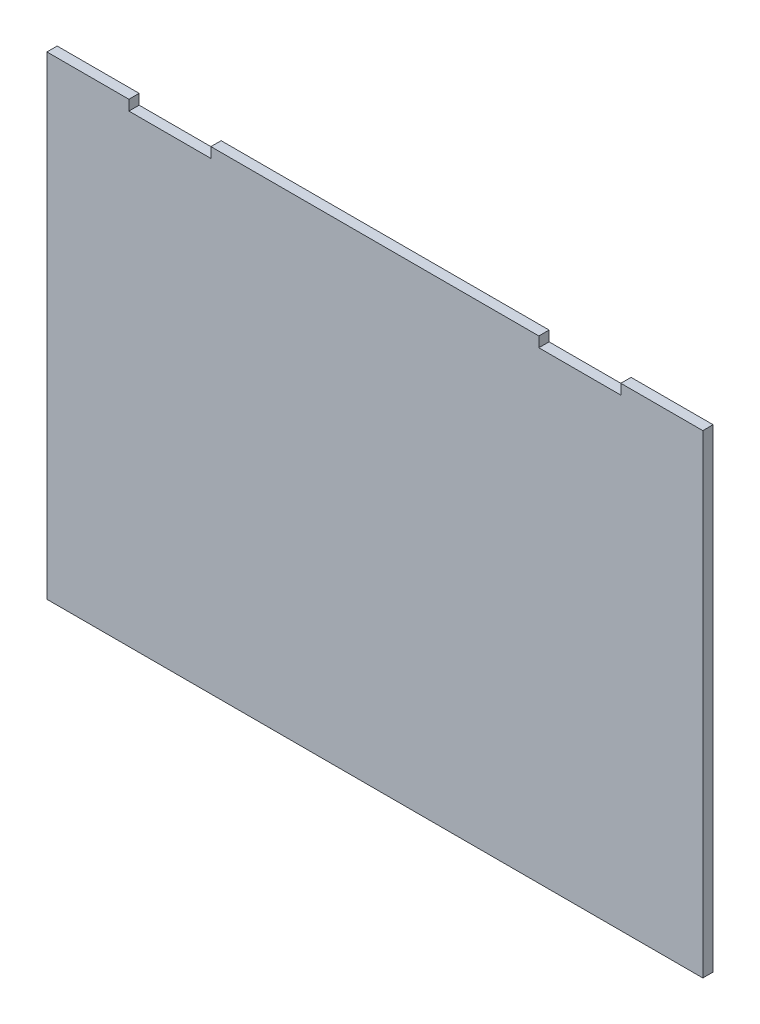
ISO-10303-21;
HEADER;
FILE_DESCRIPTION(('STEP AP214'),'2;1');
FILE_NAME('part.step','',(''),(''),'','','');
FILE_SCHEMA(('AUTOMOTIVE_DESIGN { 1 0 10303 214 1 1 1 1 }'));
ENDSEC;
DATA;
#1=APPLICATION_CONTEXT('core data for automotive mechanical design processes');
#2=APPLICATION_PROTOCOL_DEFINITION('international standard','automotive_design',2000,#1);
#3=PRODUCT_CONTEXT('',#1,'mechanical');
#4=PRODUCT('Part','Part','',(#3));
#5=PRODUCT_RELATED_PRODUCT_CATEGORY('part','',(#4));
#6=PRODUCT_DEFINITION_FORMATION('','',#4);
#7=PRODUCT_DEFINITION_CONTEXT('part definition',#1,'design');
#8=PRODUCT_DEFINITION('design','',#6,#7);
#9=PRODUCT_DEFINITION_SHAPE('','',#8);
#10=(LENGTH_UNIT() NAMED_UNIT(*) SI_UNIT(.MILLI.,.METRE.));
#11=(NAMED_UNIT(*) PLANE_ANGLE_UNIT() SI_UNIT($,.RADIAN.));
#12=(NAMED_UNIT(*) SI_UNIT($,.STERADIAN.) SOLID_ANGLE_UNIT());
#13=UNCERTAINTY_MEASURE_WITH_UNIT(LENGTH_MEASURE(1.E-05),#10,'distance_accuracy_value','');
#14=(GEOMETRIC_REPRESENTATION_CONTEXT(3) GLOBAL_UNCERTAINTY_ASSIGNED_CONTEXT((#13)) GLOBAL_UNIT_ASSIGNED_CONTEXT((#10,
#11,#12)) REPRESENTATION_CONTEXT('',''));
#15=CARTESIAN_POINT('',(0.,0.,0.));
#16=DIRECTION('',(0.,0.,1.));
#17=DIRECTION('',(1.,0.,0.));
#18=AXIS2_PLACEMENT_3D('',#15,#16,#17);
#19=CARTESIAN_POINT('',(-105.228571428572,146.8628,3.175));
#20=DIRECTION('',(1.,0.,0.));
#21=DIRECTION('',(0.,1.,0.));
#22=AXIS2_PLACEMENT_3D('',#19,#20,#21);
#23=PLANE('',#22);
#24=DIRECTION('',(0.,-1.,0.));
#25=VECTOR('',#24,1.);
#26=CARTESIAN_POINT('',(-105.228571428572,146.8628,0.));
#27=LINE('',#26,#25);
#28=CARTESIAN_POINT('',(-105.228571428572,146.8628,0.));
#29=VERTEX_POINT('',#28);
#30=CARTESIAN_POINT('',(-105.228571428572,0.,0.));
#31=VERTEX_POINT('',#30);
#32=EDGE_CURVE('E153',#29,#31,#27,.T.);
#33=ORIENTED_EDGE('',*,*,#32,.T.);
#34=DIRECTION('',(0.,0.,-1.));
#35=VECTOR('',#34,1.);
#36=CARTESIAN_POINT('',(-105.228571428572,0.,3.175));
#37=LINE('',#36,#35);
#38=CARTESIAN_POINT('',(-105.228571428572,0.,3.175));
#39=VERTEX_POINT('',#38);
#40=EDGE_CURVE('E11',#39,#31,#37,.T.);
#41=ORIENTED_EDGE('',*,*,#40,.F.);
#42=DIRECTION('',(0.,-1.,0.));
#43=VECTOR('',#42,1.);
#44=CARTESIAN_POINT('',(-105.228571428572,146.8628,3.175));
#45=LINE('',#44,#43);
#46=CARTESIAN_POINT('',(-105.228571428572,146.8628,3.175));
#47=VERTEX_POINT('',#46);
#48=EDGE_CURVE('E175',#47,#39,#45,.T.);
#49=ORIENTED_EDGE('',*,*,#48,.F.);
#50=DIRECTION('',(0.,0.,-1.));
#51=VECTOR('',#50,1.);
#52=CARTESIAN_POINT('',(-105.228571428572,146.8628,3.175));
#53=LINE('',#52,#51);
#54=EDGE_CURVE('E149',#47,#29,#53,.T.);
#55=ORIENTED_EDGE('',*,*,#54,.T.);
#56=EDGE_LOOP('',(#33,#41,#49,#55));
#57=FACE_BOUND('',#56,.T.);
#58=ADVANCED_FACE('F33',(#57),#23,.F.);
#59=CARTESIAN_POINT('',(-105.228571428572,0.,3.175));
#60=DIRECTION('',(0.,1.,0.));
#61=DIRECTION('',(0.,0.,1.));
#62=AXIS2_PLACEMENT_3D('',#59,#60,#61);
#63=PLANE('',#62);
#64=DIRECTION('',(1.,0.,0.));
#65=VECTOR('',#64,1.);
#66=CARTESIAN_POINT('',(-105.228571428572,0.,0.));
#67=LINE('',#66,#65);
#68=CARTESIAN_POINT('',(97.9714285714285,0.,0.));
#69=VERTEX_POINT('',#68);
#70=EDGE_CURVE('E156',#31,#69,#67,.T.);
#71=ORIENTED_EDGE('',*,*,#70,.T.);
#72=DIRECTION('',(0.,0.,-1.));
#73=VECTOR('',#72,1.);
#74=CARTESIAN_POINT('',(97.9714285714285,0.,3.175));
#75=LINE('',#74,#73);
#76=CARTESIAN_POINT('',(97.9714285714285,0.,3.175));
#77=VERTEX_POINT('',#76);
#78=EDGE_CURVE('E41',#77,#69,#75,.T.);
#79=ORIENTED_EDGE('',*,*,#78,.F.);
#80=DIRECTION('',(1.,0.,0.));
#81=VECTOR('',#80,1.);
#82=CARTESIAN_POINT('',(-105.228571428572,0.,3.175));
#83=LINE('',#82,#81);
#84=EDGE_CURVE('E104',#39,#77,#83,.T.);
#85=ORIENTED_EDGE('',*,*,#84,.F.);
#86=ORIENTED_EDGE('',*,*,#40,.T.);
#87=EDGE_LOOP('',(#71,#79,#85,#86));
#88=FACE_BOUND('',#87,.T.);
#89=ADVANCED_FACE('F253',(#88),#63,.F.);
#90=CARTESIAN_POINT('',(97.9714285714285,0.,3.175));
#91=DIRECTION('',(-1.,0.,0.));
#92=DIRECTION('',(0.,0.,1.));
#93=AXIS2_PLACEMENT_3D('',#90,#91,#92);
#94=PLANE('',#93);
#95=DIRECTION('',(0.,1.,0.));
#96=VECTOR('',#95,1.);
#97=CARTESIAN_POINT('',(97.9714285714285,0.,0.));
#98=LINE('',#97,#96);
#99=CARTESIAN_POINT('',(97.9714285714285,146.8628,0.));
#100=VERTEX_POINT('',#99);
#101=EDGE_CURVE('E158',#69,#100,#98,.T.);
#102=ORIENTED_EDGE('',*,*,#101,.T.);
#103=DIRECTION('',(0.,0.,-1.));
#104=VECTOR('',#103,1.);
#105=CARTESIAN_POINT('',(97.9714285714285,146.8628,3.175));
#106=LINE('',#105,#104);
#107=CARTESIAN_POINT('',(97.9714285714285,146.8628,3.175));
#108=VERTEX_POINT('',#107);
#109=EDGE_CURVE('E194',#108,#100,#106,.T.);
#110=ORIENTED_EDGE('',*,*,#109,.F.);
#111=DIRECTION('',(0.,1.,0.));
#112=VECTOR('',#111,1.);
#113=CARTESIAN_POINT('',(97.9714285714285,0.,3.175));
#114=LINE('',#113,#112);
#115=EDGE_CURVE('E202',#77,#108,#114,.T.);
#116=ORIENTED_EDGE('',*,*,#115,.F.);
#117=ORIENTED_EDGE('',*,*,#78,.T.);
#118=EDGE_LOOP('',(#102,#110,#116,#117));
#119=FACE_BOUND('',#118,.T.);
#120=ADVANCED_FACE('F200',(#119),#94,.F.);
#121=CARTESIAN_POINT('',(97.9714285714285,146.8628,3.175));
#122=DIRECTION('',(0.,-1.,0.));
#123=DIRECTION('',(1.,0.,0.));
#124=AXIS2_PLACEMENT_3D('',#121,#122,#123);
#125=PLANE('',#124);
#126=DIRECTION('',(-1.,0.,0.));
#127=VECTOR('',#126,1.);
#128=CARTESIAN_POINT('',(97.9714285714285,146.8628,0.));
#129=LINE('',#128,#127);
#130=CARTESIAN_POINT('',(72.5714285714285,146.8628,0.));
#131=VERTEX_POINT('',#130);
#132=EDGE_CURVE('E160',#100,#131,#129,.T.);
#133=ORIENTED_EDGE('',*,*,#132,.T.);
#134=DIRECTION('',(0.,0.,-1.));
#135=VECTOR('',#134,1.);
#136=CARTESIAN_POINT('',(72.5714285714285,146.8628,3.175));
#137=LINE('',#136,#135);
#138=CARTESIAN_POINT('',(72.5714285714285,146.8628,3.175));
#139=VERTEX_POINT('',#138);
#140=EDGE_CURVE('E191',#139,#131,#137,.T.);
#141=ORIENTED_EDGE('',*,*,#140,.F.);
#142=DIRECTION('',(-1.,0.,0.));
#143=VECTOR('',#142,1.);
#144=CARTESIAN_POINT('',(97.9714285714285,146.8628,3.175));
#145=LINE('',#144,#143);
#146=EDGE_CURVE('E220',#108,#139,#145,.T.);
#147=ORIENTED_EDGE('',*,*,#146,.F.);
#148=ORIENTED_EDGE('',*,*,#109,.T.);
#149=EDGE_LOOP('',(#133,#141,#147,#148));
#150=FACE_BOUND('',#149,.T.);
#151=ADVANCED_FACE('F211',(#150),#125,.F.);
#152=CARTESIAN_POINT('',(72.5714285714285,146.8628,3.175));
#153=DIRECTION('',(1.,0.,0.));
#154=DIRECTION('',(0.,0.,-1.));
#155=AXIS2_PLACEMENT_3D('',#152,#153,#154);
#156=PLANE('',#155);
#157=DIRECTION('',(0.,-1.,0.));
#158=VECTOR('',#157,1.);
#159=CARTESIAN_POINT('',(72.5714285714285,146.8628,0.));
#160=LINE('',#159,#158);
#161=CARTESIAN_POINT('',(72.5714285714285,143.6878,0.));
#162=VERTEX_POINT('',#161);
#163=EDGE_CURVE('E162',#131,#162,#160,.T.);
#164=ORIENTED_EDGE('',*,*,#163,.T.);
#165=DIRECTION('',(0.,0.,-1.));
#166=VECTOR('',#165,1.);
#167=CARTESIAN_POINT('',(72.5714285714285,143.6878,3.175));
#168=LINE('',#167,#166);
#169=CARTESIAN_POINT('',(72.5714285714285,143.6878,3.175));
#170=VERTEX_POINT('',#169);
#171=EDGE_CURVE('E188',#170,#162,#168,.T.);
#172=ORIENTED_EDGE('',*,*,#171,.F.);
#173=DIRECTION('',(0.,-1.,0.));
#174=VECTOR('',#173,1.);
#175=CARTESIAN_POINT('',(72.5714285714285,146.8628,3.175));
#176=LINE('',#175,#174);
#177=EDGE_CURVE('E217',#139,#170,#176,.T.);
#178=ORIENTED_EDGE('',*,*,#177,.F.);
#179=ORIENTED_EDGE('',*,*,#140,.T.);
#180=EDGE_LOOP('',(#164,#172,#178,#179));
#181=FACE_BOUND('',#180,.T.);
#182=ADVANCED_FACE('F215',(#181),#156,.F.);
#183=CARTESIAN_POINT('',(72.5714285714285,143.6878,3.175));
#184=DIRECTION('',(0.,-1.,0.));
#185=DIRECTION('',(1.,0.,0.));
#186=AXIS2_PLACEMENT_3D('',#183,#184,#185);
#187=PLANE('',#186);
#188=DIRECTION('',(-1.,0.,0.));
#189=VECTOR('',#188,1.);
#190=CARTESIAN_POINT('',(72.5714285714285,143.6878,0.));
#191=LINE('',#190,#189);
#192=CARTESIAN_POINT('',(47.1714285714285,143.6878,0.));
#193=VERTEX_POINT('',#192);
#194=EDGE_CURVE('E164',#162,#193,#191,.T.);
#195=ORIENTED_EDGE('',*,*,#194,.T.);
#196=DIRECTION('',(0.,0.,-1.));
#197=VECTOR('',#196,1.);
#198=CARTESIAN_POINT('',(47.1714285714285,143.6878,3.175));
#199=LINE('',#198,#197);
#200=CARTESIAN_POINT('',(47.1714285714285,143.6878,3.175));
#201=VERTEX_POINT('',#200);
#202=EDGE_CURVE('E185',#201,#193,#199,.T.);
#203=ORIENTED_EDGE('',*,*,#202,.F.);
#204=DIRECTION('',(-1.,0.,0.));
#205=VECTOR('',#204,1.);
#206=CARTESIAN_POINT('',(72.5714285714285,143.6878,3.175));
#207=LINE('',#206,#205);
#208=EDGE_CURVE('E219',#170,#201,#207,.T.);
#209=ORIENTED_EDGE('',*,*,#208,.F.);
#210=ORIENTED_EDGE('',*,*,#171,.T.);
#211=EDGE_LOOP('',(#195,#203,#209,#210));
#212=FACE_BOUND('',#211,.T.);
#213=ADVANCED_FACE('F266',(#212),#187,.F.);
#214=CARTESIAN_POINT('',(47.1714285714285,143.6878,3.175));
#215=DIRECTION('',(-1.,0.,0.));
#216=DIRECTION('',(0.,-1.,0.));
#217=AXIS2_PLACEMENT_3D('',#214,#215,#216);
#218=PLANE('',#217);
#219=DIRECTION('',(0.,1.,0.));
#220=VECTOR('',#219,1.);
#221=CARTESIAN_POINT('',(47.1714285714285,143.6878,0.));
#222=LINE('',#221,#220);
#223=CARTESIAN_POINT('',(47.1714285714284,146.8628,0.));
#224=VERTEX_POINT('',#223);
#225=EDGE_CURVE('E166',#193,#224,#222,.T.);
#226=ORIENTED_EDGE('',*,*,#225,.T.);
#227=DIRECTION('',(0.,0.,-1.));
#228=VECTOR('',#227,1.);
#229=CARTESIAN_POINT('',(47.1714285714284,146.8628,3.175));
#230=LINE('',#229,#228);
#231=CARTESIAN_POINT('',(47.1714285714284,146.8628,3.175));
#232=VERTEX_POINT('',#231);
#233=EDGE_CURVE('E182',#232,#224,#230,.T.);
#234=ORIENTED_EDGE('',*,*,#233,.F.);
#235=DIRECTION('',(0.,1.,0.));
#236=VECTOR('',#235,1.);
#237=CARTESIAN_POINT('',(47.1714285714285,143.6878,3.175));
#238=LINE('',#237,#236);
#239=EDGE_CURVE('E222',#201,#232,#238,.T.);
#240=ORIENTED_EDGE('',*,*,#239,.F.);
#241=ORIENTED_EDGE('',*,*,#202,.T.);
#242=EDGE_LOOP('',(#226,#234,#240,#241));
#243=FACE_BOUND('',#242,.T.);
#244=ADVANCED_FACE('F269',(#243),#218,.F.);
#245=CARTESIAN_POINT('',(47.1714285714284,146.8628,3.175));
#246=DIRECTION('',(0.,-1.,0.));
#247=DIRECTION('',(0.,0.,-1.));
#248=AXIS2_PLACEMENT_3D('',#245,#246,#247);
#249=PLANE('',#248);
#250=DIRECTION('',(-1.,0.,0.));
#251=VECTOR('',#250,1.);
#252=CARTESIAN_POINT('',(47.1714285714284,146.8628,0.));
#253=LINE('',#252,#251);
#254=CARTESIAN_POINT('',(-54.4285714285716,146.8628,0.));
#255=VERTEX_POINT('',#254);
#256=EDGE_CURVE('E168',#224,#255,#253,.T.);
#257=ORIENTED_EDGE('',*,*,#256,.T.);
#258=DIRECTION('',(0.,0.,-1.));
#259=VECTOR('',#258,1.);
#260=CARTESIAN_POINT('',(-54.4285714285716,146.8628,3.175));
#261=LINE('',#260,#259);
#262=CARTESIAN_POINT('',(-54.4285714285716,146.8628,3.175));
#263=VERTEX_POINT('',#262);
#264=EDGE_CURVE('E179',#263,#255,#261,.T.);
#265=ORIENTED_EDGE('',*,*,#264,.F.);
#266=DIRECTION('',(-1.,0.,0.));
#267=VECTOR('',#266,1.);
#268=CARTESIAN_POINT('',(47.1714285714284,146.8628,3.175));
#269=LINE('',#268,#267);
#270=EDGE_CURVE('E228',#232,#263,#269,.T.);
#271=ORIENTED_EDGE('',*,*,#270,.F.);
#272=ORIENTED_EDGE('',*,*,#233,.T.);
#273=EDGE_LOOP('',(#257,#265,#271,#272));
#274=FACE_BOUND('',#273,.T.);
#275=ADVANCED_FACE('F234',(#274),#249,.F.);
#276=CARTESIAN_POINT('',(-54.4285714285716,146.8628,3.175));
#277=DIRECTION('',(1.,0.,0.));
#278=DIRECTION('',(0.,0.,-1.));
#279=AXIS2_PLACEMENT_3D('',#276,#277,#278);
#280=PLANE('',#279);
#281=DIRECTION('',(0.,-1.,0.));
#282=VECTOR('',#281,1.);
#283=CARTESIAN_POINT('',(-54.4285714285716,146.8628,0.));
#284=LINE('',#283,#282);
#285=CARTESIAN_POINT('',(-54.4285714285716,143.6878,0.));
#286=VERTEX_POINT('',#285);
#287=EDGE_CURVE('E170',#255,#286,#284,.T.);
#288=ORIENTED_EDGE('',*,*,#287,.T.);
#289=DIRECTION('',(0.,0.,-1.));
#290=VECTOR('',#289,1.);
#291=CARTESIAN_POINT('',(-54.4285714285716,143.6878,3.175));
#292=LINE('',#291,#290);
#293=CARTESIAN_POINT('',(-54.4285714285716,143.6878,3.175));
#294=VERTEX_POINT('',#293);
#295=EDGE_CURVE('E144',#294,#286,#292,.T.);
#296=ORIENTED_EDGE('',*,*,#295,.F.);
#297=DIRECTION('',(0.,-1.,0.));
#298=VECTOR('',#297,1.);
#299=CARTESIAN_POINT('',(-54.4285714285716,146.8628,3.175));
#300=LINE('',#299,#298);
#301=EDGE_CURVE('E135',#263,#294,#300,.T.);
#302=ORIENTED_EDGE('',*,*,#301,.F.);
#303=ORIENTED_EDGE('',*,*,#264,.T.);
#304=EDGE_LOOP('',(#288,#296,#302,#303));
#305=FACE_BOUND('',#304,.T.);
#306=ADVANCED_FACE('F238',(#305),#280,.F.);
#307=CARTESIAN_POINT('',(-54.4285714285716,143.6878,3.175));
#308=DIRECTION('',(0.,-1.,0.));
#309=DIRECTION('',(0.,0.,-1.));
#310=AXIS2_PLACEMENT_3D('',#307,#308,#309);
#311=PLANE('',#310);
#312=DIRECTION('',(-1.,0.,0.));
#313=VECTOR('',#312,1.);
#314=CARTESIAN_POINT('',(-54.4285714285716,143.6878,0.));
#315=LINE('',#314,#313);
#316=CARTESIAN_POINT('',(-79.8285714285715,143.6878,0.));
#317=VERTEX_POINT('',#316);
#318=EDGE_CURVE('E143',#286,#317,#315,.T.);
#319=ORIENTED_EDGE('',*,*,#318,.T.);
#320=DIRECTION('',(0.,0.,-1.));
#321=VECTOR('',#320,1.);
#322=CARTESIAN_POINT('',(-79.8285714285715,143.6878,3.175));
#323=LINE('',#322,#321);
#324=CARTESIAN_POINT('',(-79.8285714285715,143.6878,3.175));
#325=VERTEX_POINT('',#324);
#326=EDGE_CURVE('E140',#325,#317,#323,.T.);
#327=ORIENTED_EDGE('',*,*,#326,.F.);
#328=DIRECTION('',(-1.,0.,0.));
#329=VECTOR('',#328,1.);
#330=CARTESIAN_POINT('',(-54.4285714285716,143.6878,3.175));
#331=LINE('',#330,#329);
#332=EDGE_CURVE('E129',#294,#325,#331,.T.);
#333=ORIENTED_EDGE('',*,*,#332,.F.);
#334=ORIENTED_EDGE('',*,*,#295,.T.);
#335=EDGE_LOOP('',(#319,#327,#333,#334));
#336=FACE_BOUND('',#335,.T.);
#337=ADVANCED_FACE('F141',(#336),#311,.F.);
#338=CARTESIAN_POINT('',(-79.8285714285715,143.6878,3.175));
#339=DIRECTION('',(-1.,0.,0.));
#340=DIRECTION('',(0.,0.,1.));
#341=AXIS2_PLACEMENT_3D('',#338,#339,#340);
#342=PLANE('',#341);
#343=DIRECTION('',(0.,1.,0.));
#344=VECTOR('',#343,1.);
#345=CARTESIAN_POINT('',(-79.8285714285715,143.6878,0.));
#346=LINE('',#345,#344);
#347=CARTESIAN_POINT('',(-79.8285714285715,146.8628,0.));
#348=VERTEX_POINT('',#347);
#349=EDGE_CURVE('E90',#317,#348,#346,.T.);
#350=ORIENTED_EDGE('',*,*,#349,.T.);
#351=DIRECTION('',(0.,0.,-1.));
#352=VECTOR('',#351,1.);
#353=CARTESIAN_POINT('',(-79.8285714285715,146.8628,3.175));
#354=LINE('',#353,#352);
#355=CARTESIAN_POINT('',(-79.8285714285715,146.8628,3.175));
#356=VERTEX_POINT('',#355);
#357=EDGE_CURVE('E145',#356,#348,#354,.T.);
#358=ORIENTED_EDGE('',*,*,#357,.F.);
#359=DIRECTION('',(0.,1.,0.));
#360=VECTOR('',#359,1.);
#361=CARTESIAN_POINT('',(-79.8285714285715,143.6878,3.175));
#362=LINE('',#361,#360);
#363=EDGE_CURVE('E133',#325,#356,#362,.T.);
#364=ORIENTED_EDGE('',*,*,#363,.F.);
#365=ORIENTED_EDGE('',*,*,#326,.T.);
#366=EDGE_LOOP('',(#350,#358,#364,#365));
#367=FACE_BOUND('',#366,.T.);
#368=ADVANCED_FACE('F147',(#367),#342,.F.);
#369=CARTESIAN_POINT('',(-79.8285714285715,146.8628,3.175));
#370=DIRECTION('',(0.,-1.,0.));
#371=DIRECTION('',(1.,0.,0.));
#372=AXIS2_PLACEMENT_3D('',#369,#370,#371);
#373=PLANE('',#372);
#374=DIRECTION('',(-1.,0.,0.));
#375=VECTOR('',#374,1.);
#376=CARTESIAN_POINT('',(-79.8285714285715,146.8628,0.));
#377=LINE('',#376,#375);
#378=EDGE_CURVE('E96',#348,#29,#377,.T.);
#379=ORIENTED_EDGE('',*,*,#378,.T.);
#380=ORIENTED_EDGE('',*,*,#54,.F.);
#381=DIRECTION('',(-1.,0.,0.));
#382=VECTOR('',#381,1.);
#383=CARTESIAN_POINT('',(-79.8285714285715,146.8628,3.175));
#384=LINE('',#383,#382);
#385=EDGE_CURVE('E49',#356,#47,#384,.T.);
#386=ORIENTED_EDGE('',*,*,#385,.F.);
#387=ORIENTED_EDGE('',*,*,#357,.T.);
#388=EDGE_LOOP('',(#379,#380,#386,#387));
#389=FACE_BOUND('',#388,.T.);
#390=ADVANCED_FACE('F242',(#389),#373,.F.);
#391=CARTESIAN_POINT('',(0.,0.,3.175));
#392=DIRECTION('',(0.,0.,1.));
#393=DIRECTION('',(1.,0.,0.));
#394=AXIS2_PLACEMENT_3D('',#391,#392,#393);
#395=PLANE('',#394);
#396=ORIENTED_EDGE('',*,*,#48,.T.);
#397=ORIENTED_EDGE('',*,*,#84,.T.);
#398=ORIENTED_EDGE('',*,*,#115,.T.);
#399=ORIENTED_EDGE('',*,*,#146,.T.);
#400=ORIENTED_EDGE('',*,*,#177,.T.);
#401=ORIENTED_EDGE('',*,*,#208,.T.);
#402=ORIENTED_EDGE('',*,*,#239,.T.);
#403=ORIENTED_EDGE('',*,*,#270,.T.);
#404=ORIENTED_EDGE('',*,*,#301,.T.);
#405=ORIENTED_EDGE('',*,*,#332,.T.);
#406=ORIENTED_EDGE('',*,*,#363,.T.);
#407=ORIENTED_EDGE('',*,*,#385,.T.);
#408=EDGE_LOOP('',(#396,#397,#398,#399,#400,#401,#402,#403,#404,#405,#406,#407));
#409=FACE_BOUND('',#408,.T.);
#410=ADVANCED_FACE('F131',(#409),#395,.T.);
#411=CARTESIAN_POINT('',(0.,0.,0.));
#412=DIRECTION('',(0.,0.,1.));
#413=DIRECTION('',(1.,0.,0.));
#414=AXIS2_PLACEMENT_3D('',#411,#412,#413);
#415=PLANE('',#414);
#416=ORIENTED_EDGE('',*,*,#32,.F.);
#417=ORIENTED_EDGE('',*,*,#378,.F.);
#418=ORIENTED_EDGE('',*,*,#349,.F.);
#419=ORIENTED_EDGE('',*,*,#318,.F.);
#420=ORIENTED_EDGE('',*,*,#287,.F.);
#421=ORIENTED_EDGE('',*,*,#256,.F.);
#422=ORIENTED_EDGE('',*,*,#225,.F.);
#423=ORIENTED_EDGE('',*,*,#194,.F.);
#424=ORIENTED_EDGE('',*,*,#163,.F.);
#425=ORIENTED_EDGE('',*,*,#132,.F.);
#426=ORIENTED_EDGE('',*,*,#101,.F.);
#427=ORIENTED_EDGE('',*,*,#70,.F.);
#428=EDGE_LOOP('',(#416,#417,#418,#419,#420,#421,#422,#423,#424,#425,#426,#427));
#429=FACE_BOUND('',#428,.T.);
#430=ADVANCED_FACE('F206',(#429),#415,.F.);
#431=CLOSED_SHELL('',(#58,#89,#120,#151,#182,#213,#244,#275,#306,#337,#368,#390,#410,#430));
#432=MANIFOLD_SOLID_BREP('B2',#431);
#433=ADVANCED_BREP_SHAPE_REPRESENTATION('',(#18,#432),#14);
#434=SHAPE_DEFINITION_REPRESENTATION(#9,#433);
ENDSEC;
END-ISO-10303-21;
